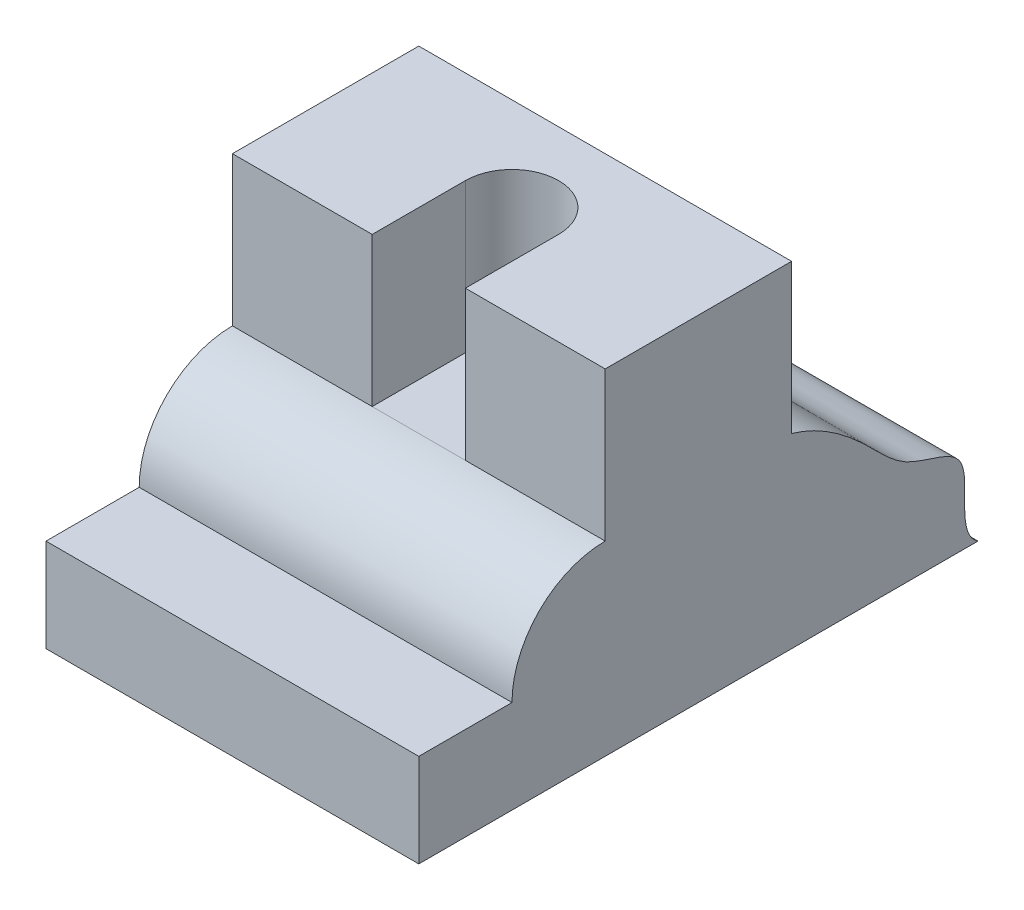
ISO-10303-21;
HEADER;
FILE_DESCRIPTION(('STEP AP214'),'2;1');
FILE_NAME('part.step','',(''),(''),'','','');
FILE_SCHEMA(('AUTOMOTIVE_DESIGN { 1 0 10303 214 1 1 1 1 }'));
ENDSEC;
DATA;
#1=APPLICATION_CONTEXT('core data for automotive mechanical design processes');
#2=APPLICATION_PROTOCOL_DEFINITION('international standard','automotive_design',2000,#1);
#3=PRODUCT_CONTEXT('',#1,'mechanical');
#4=PRODUCT('Part','Part','',(#3));
#5=PRODUCT_RELATED_PRODUCT_CATEGORY('part','',(#4));
#6=PRODUCT_DEFINITION_FORMATION('','',#4);
#7=PRODUCT_DEFINITION_CONTEXT('part definition',#1,'design');
#8=PRODUCT_DEFINITION('design','',#6,#7);
#9=PRODUCT_DEFINITION_SHAPE('','',#8);
#10=(LENGTH_UNIT() NAMED_UNIT(*) SI_UNIT(.MILLI.,.METRE.));
#11=(NAMED_UNIT(*) PLANE_ANGLE_UNIT() SI_UNIT($,.RADIAN.));
#12=(NAMED_UNIT(*) SI_UNIT($,.STERADIAN.) SOLID_ANGLE_UNIT());
#13=UNCERTAINTY_MEASURE_WITH_UNIT(LENGTH_MEASURE(1.E-05),#10,'distance_accuracy_value','');
#14=(GEOMETRIC_REPRESENTATION_CONTEXT(3) GLOBAL_UNCERTAINTY_ASSIGNED_CONTEXT((#13)) GLOBAL_UNIT_ASSIGNED_CONTEXT((#10,
#11,#12)) REPRESENTATION_CONTEXT('',''));
#15=CARTESIAN_POINT('',(0.,0.,0.));
#16=DIRECTION('',(0.,0.,1.));
#17=DIRECTION('',(1.,0.,0.));
#18=AXIS2_PLACEMENT_3D('',#15,#16,#17);
#19=CARTESIAN_POINT('',(0.,100.,0.));
#20=DIRECTION('',(0.,-1.,0.));
#21=DIRECTION('',(0.,0.,-1.));
#22=AXIS2_PLACEMENT_3D('',#19,#20,#21);
#23=PLANE('',#22);
#24=DIRECTION('',(0.,0.,1.));
#25=VECTOR('',#24,1.);
#26=CARTESIAN_POINT('',(25.,100.,0.));
#27=LINE('',#26,#25);
#28=CARTESIAN_POINT('',(25.,100.,0.));
#29=VERTEX_POINT('',#28);
#30=CARTESIAN_POINT('',(25.,100.,50.));
#31=VERTEX_POINT('',#30);
#32=EDGE_CURVE('E56',#29,#31,#27,.T.);
#33=ORIENTED_EDGE('',*,*,#32,.F.);
#34=CARTESIAN_POINT('',(0.,100.,0.));
#35=DIRECTION('',(0.,-1.,0.));
#36=DIRECTION('',(0.,0.,1.));
#37=AXIS2_PLACEMENT_3D('',#34,#35,#36);
#38=CIRCLE('',#37,25.);
#39=CARTESIAN_POINT('',(-25.,100.,0.));
#40=VERTEX_POINT('',#39);
#41=EDGE_CURVE('E265',#40,#29,#38,.T.);
#42=ORIENTED_EDGE('',*,*,#41,.F.);
#43=DIRECTION('',(0.,0.,-1.));
#44=VECTOR('',#43,1.);
#45=CARTESIAN_POINT('',(-25.,100.,0.));
#46=LINE('',#45,#44);
#47=CARTESIAN_POINT('',(-25.,100.,50.));
#48=VERTEX_POINT('',#47);
#49=EDGE_CURVE('E270',#48,#40,#46,.T.);
#50=ORIENTED_EDGE('',*,*,#49,.F.);
#51=DIRECTION('',(1.,0.,0.));
#52=VECTOR('',#51,1.);
#53=CARTESIAN_POINT('',(-100.,100.,50.));
#54=LINE('',#53,#52);
#55=EDGE_CURVE('E48',#48,#31,#54,.T.);
#56=ORIENTED_EDGE('',*,*,#55,.T.);
#57=EDGE_LOOP('',(#33,#42,#50,#56));
#58=FACE_BOUND('',#57,.T.);
#59=ADVANCED_FACE('F39',(#58),#23,.F.);
#60=CARTESIAN_POINT('',(100.,100.,50.));
#61=DIRECTION('',(-1.,0.,0.));
#62=DIRECTION('',(0.,0.,1.));
#63=AXIS2_PLACEMENT_3D('',#60,#61,#62);
#64=PLANE('',#63);
#65=DIRECTION('',(0.,0.,-1.));
#66=VECTOR('',#65,1.);
#67=CARTESIAN_POINT('',(100.,0.,50.));
#68=LINE('',#67,#66);
#69=CARTESIAN_POINT('',(100.,0.,150.));
#70=VERTEX_POINT('',#69);
#71=CARTESIAN_POINT('',(100.,0.,-150.));
#72=VERTEX_POINT('',#71);
#73=EDGE_CURVE('E208',#70,#72,#68,.T.);
#74=ORIENTED_EDGE('',*,*,#73,.T.);
#75=CARTESIAN_POINT('',(100.,100.,-50.));
#76=CARTESIAN_POINT('',(100.,95.1222642668294,-66.7214384147463));
#77=CARTESIAN_POINT('',(100.,78.4454646816312,-87.6218480772081));
#78=CARTESIAN_POINT('',(100.,51.7988343236468,-111.427617310337));
#79=CARTESIAN_POINT('',(100.,47.4008161064059,-153.788531601574));
#80=CARTESIAN_POINT('',(100.,8.56832187900159,-137.140673225042));
#81=CARTESIAN_POINT('',(100.,0.,-150.));
#82=B_SPLINE_CURVE_WITH_KNOTS('',3,(#75,#76,#77,#78,#79,#80,#81),.UNSPECIFIED.,.F.,.F.,(4,1,1,1,
4),(0.,0.338265493761551,0.517817436766426,0.712666980927499,1.),.UNSPECIFIED.);
#83=CARTESIAN_POINT('',(100.,100.,-50.));
#84=VERTEX_POINT('',#83);
#85=EDGE_CURVE('E159',#84,#72,#82,.T.);
#86=ORIENTED_EDGE('',*,*,#85,.F.);
#87=DIRECTION('',(0.,-1.,0.));
#88=VECTOR('',#87,1.);
#89=CARTESIAN_POINT('',(100.,180.,-50.));
#90=LINE('',#89,#88);
#91=CARTESIAN_POINT('',(100.,180.,-50.));
#92=VERTEX_POINT('',#91);
#93=EDGE_CURVE('E243',#92,#84,#90,.T.);
#94=ORIENTED_EDGE('',*,*,#93,.F.);
#95=DIRECTION('',(0.,0.,-1.));
#96=VECTOR('',#95,1.);
#97=CARTESIAN_POINT('',(100.,180.,50.));
#98=LINE('',#97,#96);
#99=CARTESIAN_POINT('',(100.,180.,50.));
#100=VERTEX_POINT('',#99);
#101=EDGE_CURVE('E247',#100,#92,#98,.T.);
#102=ORIENTED_EDGE('',*,*,#101,.F.);
#103=DIRECTION('',(0.,-1.,0.));
#104=VECTOR('',#103,1.);
#105=CARTESIAN_POINT('',(100.,180.,50.));
#106=LINE('',#105,#104);
#107=CARTESIAN_POINT('',(100.,100.,50.));
#108=VERTEX_POINT('',#107);
#109=EDGE_CURVE('E245',#100,#108,#106,.T.);
#110=ORIENTED_EDGE('',*,*,#109,.T.);
#111=CARTESIAN_POINT('',(100.,50.,50.));
#112=DIRECTION('',(-1.,0.,0.));
#113=DIRECTION('',(0.,0.,1.));
#114=AXIS2_PLACEMENT_3D('',#111,#112,#113);
#115=CIRCLE('',#114,50.);
#116=CARTESIAN_POINT('',(100.,50.,100.));
#117=VERTEX_POINT('',#116);
#118=EDGE_CURVE('E228',#117,#108,#115,.T.);
#119=ORIENTED_EDGE('',*,*,#118,.F.);
#120=DIRECTION('',(0.,0.,-1.));
#121=VECTOR('',#120,1.);
#122=CARTESIAN_POINT('',(100.,50.,100.));
#123=LINE('',#122,#121);
#124=CARTESIAN_POINT('',(100.,50.,150.));
#125=VERTEX_POINT('',#124);
#126=EDGE_CURVE('E237',#125,#117,#123,.T.);
#127=ORIENTED_EDGE('',*,*,#126,.F.);
#128=DIRECTION('',(0.,1.,0.));
#129=VECTOR('',#128,1.);
#130=CARTESIAN_POINT('',(100.,50.,150.));
#131=LINE('',#130,#129);
#132=EDGE_CURVE('E214',#70,#125,#131,.T.);
#133=ORIENTED_EDGE('',*,*,#132,.F.);
#134=EDGE_LOOP('',(#74,#86,#94,#102,#110,#119,#127,#133));
#135=FACE_BOUND('',#134,.T.);
#136=ADVANCED_FACE('F41',(#135),#64,.F.);
#137=CARTESIAN_POINT('',(-100.,100.,50.));
#138=DIRECTION('',(1.,0.,0.));
#139=DIRECTION('',(0.,0.,-1.));
#140=AXIS2_PLACEMENT_3D('',#137,#138,#139);
#141=PLANE('',#140);
#142=DIRECTION('',(0.,0.,1.));
#143=VECTOR('',#142,1.);
#144=CARTESIAN_POINT('',(-100.,0.,50.));
#145=LINE('',#144,#143);
#146=CARTESIAN_POINT('',(-100.,0.,-150.));
#147=VERTEX_POINT('',#146);
#148=CARTESIAN_POINT('',(-100.,0.,150.));
#149=VERTEX_POINT('',#148);
#150=EDGE_CURVE('E43',#147,#149,#145,.T.);
#151=ORIENTED_EDGE('',*,*,#150,.T.);
#152=DIRECTION('',(0.,1.,0.));
#153=VECTOR('',#152,1.);
#154=CARTESIAN_POINT('',(-100.,50.,150.));
#155=LINE('',#154,#153);
#156=CARTESIAN_POINT('',(-100.,50.,150.));
#157=VERTEX_POINT('',#156);
#158=EDGE_CURVE('E219',#149,#157,#155,.T.);
#159=ORIENTED_EDGE('',*,*,#158,.T.);
#160=DIRECTION('',(0.,0.,-1.));
#161=VECTOR('',#160,1.);
#162=CARTESIAN_POINT('',(-100.,50.,100.));
#163=LINE('',#162,#161);
#164=CARTESIAN_POINT('',(-100.,50.,100.));
#165=VERTEX_POINT('',#164);
#166=EDGE_CURVE('E232',#157,#165,#163,.T.);
#167=ORIENTED_EDGE('',*,*,#166,.T.);
#168=CARTESIAN_POINT('',(-100.,50.,50.));
#169=DIRECTION('',(-1.,0.,0.));
#170=DIRECTION('',(0.,0.,1.));
#171=AXIS2_PLACEMENT_3D('',#168,#169,#170);
#172=CIRCLE('',#171,50.);
#173=CARTESIAN_POINT('',(-100.,100.,50.));
#174=VERTEX_POINT('',#173);
#175=EDGE_CURVE('E155',#165,#174,#172,.T.);
#176=ORIENTED_EDGE('',*,*,#175,.T.);
#177=DIRECTION('',(0.,-1.,0.));
#178=VECTOR('',#177,1.);
#179=CARTESIAN_POINT('',(-100.,180.,50.));
#180=LINE('',#179,#178);
#181=CARTESIAN_POINT('',(-100.,180.,50.));
#182=VERTEX_POINT('',#181);
#183=EDGE_CURVE('E135',#182,#174,#180,.T.);
#184=ORIENTED_EDGE('',*,*,#183,.F.);
#185=DIRECTION('',(0.,0.,1.));
#186=VECTOR('',#185,1.);
#187=CARTESIAN_POINT('',(-100.,180.,50.));
#188=LINE('',#187,#186);
#189=CARTESIAN_POINT('',(-100.,180.,-50.));
#190=VERTEX_POINT('',#189);
#191=EDGE_CURVE('E141',#190,#182,#188,.T.);
#192=ORIENTED_EDGE('',*,*,#191,.F.);
#193=DIRECTION('',(0.,-1.,0.));
#194=VECTOR('',#193,1.);
#195=CARTESIAN_POINT('',(-100.,180.,-50.));
#196=LINE('',#195,#194);
#197=CARTESIAN_POINT('',(-100.,100.,-50.));
#198=VERTEX_POINT('',#197);
#199=EDGE_CURVE('E242',#190,#198,#196,.T.);
#200=ORIENTED_EDGE('',*,*,#199,.T.);
#201=CARTESIAN_POINT('',(-100.,100.,-50.));
#202=CARTESIAN_POINT('',(-100.,95.1222642668294,-66.7214384147463));
#203=CARTESIAN_POINT('',(-100.,78.4454646816312,-87.6218480772081));
#204=CARTESIAN_POINT('',(-100.,51.7988343236468,-111.427617310337));
#205=CARTESIAN_POINT('',(-100.,47.4008161064059,-153.788531601574));
#206=CARTESIAN_POINT('',(-100.,8.56832187900159,-137.140673225042));
#207=CARTESIAN_POINT('',(-100.,0.,-150.));
#208=B_SPLINE_CURVE_WITH_KNOTS('',3,(#201,#202,#203,#204,#205,#206,#207),.UNSPECIFIED.,.F.,.F.,
(4,1,1,1,4),(0.,0.338265493761551,0.517817436766426,0.712666980927499,1.),.UNSPECIFIED.);
#209=EDGE_CURVE('E156',#198,#147,#208,.T.);
#210=ORIENTED_EDGE('',*,*,#209,.T.);
#211=EDGE_LOOP('',(#151,#159,#167,#176,#184,#192,#200,#210));
#212=FACE_BOUND('',#211,.T.);
#213=ADVANCED_FACE('F152',(#212),#141,.F.);
#214=CARTESIAN_POINT('',(0.,0.,0.));
#215=DIRECTION('',(0.,-1.,0.));
#216=DIRECTION('',(0.,0.,-1.));
#217=AXIS2_PLACEMENT_3D('',#214,#215,#216);
#218=PLANE('',#217);
#219=ORIENTED_EDGE('',*,*,#73,.F.);
#220=DIRECTION('',(-1.,0.,0.));
#221=VECTOR('',#220,1.);
#222=CARTESIAN_POINT('',(100.,0.,150.));
#223=LINE('',#222,#221);
#224=EDGE_CURVE('E225',#70,#149,#223,.T.);
#225=ORIENTED_EDGE('',*,*,#224,.T.);
#226=ORIENTED_EDGE('',*,*,#150,.F.);
#227=DIRECTION('',(-1.,0.,0.));
#228=VECTOR('',#227,1.);
#229=CARTESIAN_POINT('',(100.,0.,-150.));
#230=LINE('',#229,#228);
#231=EDGE_CURVE('E169',#72,#147,#230,.T.);
#232=ORIENTED_EDGE('',*,*,#231,.F.);
#233=EDGE_LOOP('',(#219,#225,#226,#232));
#234=FACE_BOUND('',#233,.T.);
#235=ADVANCED_FACE('F188',(#234),#218,.T.);
#236=CARTESIAN_POINT('',(100.,50.,50.));
#237=DIRECTION('',(-1.,0.,0.));
#238=DIRECTION('',(0.,0.,1.));
#239=AXIS2_PLACEMENT_3D('',#236,#237,#238);
#240=CYLINDRICAL_SURFACE('',#239,50.);
#241=ORIENTED_EDGE('',*,*,#175,.F.);
#242=DIRECTION('',(-1.,0.,0.));
#243=VECTOR('',#242,1.);
#244=CARTESIAN_POINT('',(100.,50.,100.));
#245=LINE('',#244,#243);
#246=EDGE_CURVE('E217',#117,#165,#245,.T.);
#247=ORIENTED_EDGE('',*,*,#246,.F.);
#248=ORIENTED_EDGE('',*,*,#118,.T.);
#249=DIRECTION('',(1.,0.,0.));
#250=VECTOR('',#249,1.);
#251=CARTESIAN_POINT('',(100.,100.,50.));
#252=LINE('',#251,#250);
#253=EDGE_CURVE('E64',#31,#108,#252,.T.);
#254=ORIENTED_EDGE('',*,*,#253,.F.);
#255=ORIENTED_EDGE('',*,*,#55,.F.);
#256=EDGE_CURVE('E11',#174,#48,#54,.T.);
#257=ORIENTED_EDGE('',*,*,#256,.F.);
#258=EDGE_LOOP('',(#241,#247,#248,#254,#255,#257));
#259=FACE_BOUND('',#258,.T.);
#260=ADVANCED_FACE('F184',(#259),#240,.T.);
#261=CARTESIAN_POINT('',(100.,50.,100.));
#262=DIRECTION('',(0.,1.,0.));
#263=DIRECTION('',(0.,0.,1.));
#264=AXIS2_PLACEMENT_3D('',#261,#262,#263);
#265=PLANE('',#264);
#266=ORIENTED_EDGE('',*,*,#166,.F.);
#267=DIRECTION('',(-1.,0.,0.));
#268=VECTOR('',#267,1.);
#269=CARTESIAN_POINT('',(100.,50.,150.));
#270=LINE('',#269,#268);
#271=EDGE_CURVE('E227',#125,#157,#270,.T.);
#272=ORIENTED_EDGE('',*,*,#271,.F.);
#273=ORIENTED_EDGE('',*,*,#126,.T.);
#274=ORIENTED_EDGE('',*,*,#246,.T.);
#275=EDGE_LOOP('',(#266,#272,#273,#274));
#276=FACE_BOUND('',#275,.T.);
#277=ADVANCED_FACE('F187',(#276),#265,.T.);
#278=CARTESIAN_POINT('',(100.,50.,150.));
#279=DIRECTION('',(0.,0.,1.));
#280=DIRECTION('',(1.,0.,0.));
#281=AXIS2_PLACEMENT_3D('',#278,#279,#280);
#282=PLANE('',#281);
#283=ORIENTED_EDGE('',*,*,#158,.F.);
#284=ORIENTED_EDGE('',*,*,#224,.F.);
#285=ORIENTED_EDGE('',*,*,#132,.T.);
#286=ORIENTED_EDGE('',*,*,#271,.T.);
#287=EDGE_LOOP('',(#283,#284,#285,#286));
#288=FACE_BOUND('',#287,.T.);
#289=ADVANCED_FACE('F181',(#288),#282,.T.);
#290=DIRECTION('',(-1.,0.,0.));
#291=VECTOR('',#290,1.);
#292=SURFACE_OF_LINEAR_EXTRUSION('',#82,#291);
#293=ORIENTED_EDGE('',*,*,#209,.F.);
#294=DIRECTION('',(-1.,0.,0.));
#295=VECTOR('',#294,1.);
#296=CARTESIAN_POINT('',(-100.,100.,-50.));
#297=LINE('',#296,#295);
#298=EDGE_CURVE('E221',#84,#198,#297,.T.);
#299=ORIENTED_EDGE('',*,*,#298,.F.);
#300=ORIENTED_EDGE('',*,*,#85,.T.);
#301=ORIENTED_EDGE('',*,*,#231,.T.);
#302=EDGE_LOOP('',(#293,#299,#300,#301));
#303=FACE_BOUND('',#302,.T.);
#304=ADVANCED_FACE('F177',(#303),#292,.T.);
#305=CARTESIAN_POINT('',(-25.,180.,50.));
#306=DIRECTION('',(0.,0.,-1.));
#307=DIRECTION('',(-1.,0.,0.));
#308=AXIS2_PLACEMENT_3D('',#305,#306,#307);
#309=PLANE('',#308);
#310=ORIENTED_EDGE('',*,*,#256,.T.);
#311=DIRECTION('',(0.,-1.,0.));
#312=VECTOR('',#311,1.);
#313=CARTESIAN_POINT('',(-25.,180.,50.));
#314=LINE('',#313,#312);
#315=CARTESIAN_POINT('',(-25.,180.,50.));
#316=VERTEX_POINT('',#315);
#317=EDGE_CURVE('E137',#316,#48,#314,.T.);
#318=ORIENTED_EDGE('',*,*,#317,.F.);
#319=DIRECTION('',(1.,0.,0.));
#320=VECTOR('',#319,1.);
#321=CARTESIAN_POINT('',(-25.,180.,50.));
#322=LINE('',#321,#320);
#323=EDGE_CURVE('E131',#182,#316,#322,.T.);
#324=ORIENTED_EDGE('',*,*,#323,.F.);
#325=ORIENTED_EDGE('',*,*,#183,.T.);
#326=EDGE_LOOP('',(#310,#318,#324,#325));
#327=FACE_BOUND('',#326,.T.);
#328=ADVANCED_FACE('F133',(#327),#309,.F.);
#329=CARTESIAN_POINT('',(-25.,180.,0.));
#330=DIRECTION('',(-1.,0.,0.));
#331=DIRECTION('',(0.,0.,1.));
#332=AXIS2_PLACEMENT_3D('',#329,#330,#331);
#333=PLANE('',#332);
#334=ORIENTED_EDGE('',*,*,#49,.T.);
#335=DIRECTION('',(0.,-1.,0.));
#336=VECTOR('',#335,1.);
#337=CARTESIAN_POINT('',(-25.,180.,0.));
#338=LINE('',#337,#336);
#339=CARTESIAN_POINT('',(-25.,180.,0.));
#340=VERTEX_POINT('',#339);
#341=EDGE_CURVE('E161',#340,#40,#338,.T.);
#342=ORIENTED_EDGE('',*,*,#341,.F.);
#343=DIRECTION('',(0.,0.,-1.));
#344=VECTOR('',#343,1.);
#345=CARTESIAN_POINT('',(-25.,180.,0.));
#346=LINE('',#345,#344);
#347=EDGE_CURVE('E140',#316,#340,#346,.T.);
#348=ORIENTED_EDGE('',*,*,#347,.F.);
#349=ORIENTED_EDGE('',*,*,#317,.T.);
#350=EDGE_LOOP('',(#334,#342,#348,#349));
#351=FACE_BOUND('',#350,.T.);
#352=ADVANCED_FACE('F269',(#351),#333,.F.);
#353=CARTESIAN_POINT('',(0.,180.,0.));
#354=DIRECTION('',(0.,-1.,0.));
#355=DIRECTION('',(0.,0.,-1.));
#356=AXIS2_PLACEMENT_3D('',#353,#354,#355);
#357=CYLINDRICAL_SURFACE('',#356,25.);
#358=ORIENTED_EDGE('',*,*,#41,.T.);
#359=DIRECTION('',(0.,-1.,0.));
#360=VECTOR('',#359,1.);
#361=CARTESIAN_POINT('',(25.,180.,0.));
#362=LINE('',#361,#360);
#363=CARTESIAN_POINT('',(25.,180.,0.));
#364=VERTEX_POINT('',#363);
#365=EDGE_CURVE('E257',#364,#29,#362,.T.);
#366=ORIENTED_EDGE('',*,*,#365,.F.);
#367=CARTESIAN_POINT('',(0.,180.,0.));
#368=DIRECTION('',(0.,-1.,0.));
#369=DIRECTION('',(0.,0.,1.));
#370=AXIS2_PLACEMENT_3D('',#367,#368,#369);
#371=CIRCLE('',#370,25.);
#372=EDGE_CURVE('E266',#340,#364,#371,.T.);
#373=ORIENTED_EDGE('',*,*,#372,.F.);
#374=ORIENTED_EDGE('',*,*,#341,.T.);
#375=EDGE_LOOP('',(#358,#366,#373,#374));
#376=FACE_BOUND('',#375,.T.);
#377=ADVANCED_FACE('F263',(#376),#357,.F.);
#378=CARTESIAN_POINT('',(25.,180.,0.));
#379=DIRECTION('',(1.,0.,0.));
#380=DIRECTION('',(0.,0.,-1.));
#381=AXIS2_PLACEMENT_3D('',#378,#379,#380);
#382=PLANE('',#381);
#383=ORIENTED_EDGE('',*,*,#32,.T.);
#384=DIRECTION('',(0.,-1.,0.));
#385=VECTOR('',#384,1.);
#386=CARTESIAN_POINT('',(25.,180.,50.));
#387=LINE('',#386,#385);
#388=CARTESIAN_POINT('',(25.,180.,50.));
#389=VERTEX_POINT('',#388);
#390=EDGE_CURVE('E254',#389,#31,#387,.T.);
#391=ORIENTED_EDGE('',*,*,#390,.F.);
#392=DIRECTION('',(0.,0.,1.));
#393=VECTOR('',#392,1.);
#394=CARTESIAN_POINT('',(25.,180.,0.));
#395=LINE('',#394,#393);
#396=EDGE_CURVE('E283',#364,#389,#395,.T.);
#397=ORIENTED_EDGE('',*,*,#396,.F.);
#398=ORIENTED_EDGE('',*,*,#365,.T.);
#399=EDGE_LOOP('',(#383,#391,#397,#398));
#400=FACE_BOUND('',#399,.T.);
#401=ADVANCED_FACE('F289',(#400),#382,.F.);
#402=CARTESIAN_POINT('',(100.,180.,50.));
#403=DIRECTION('',(0.,0.,-1.));
#404=DIRECTION('',(-1.,0.,0.));
#405=AXIS2_PLACEMENT_3D('',#402,#403,#404);
#406=PLANE('',#405);
#407=ORIENTED_EDGE('',*,*,#253,.T.);
#408=ORIENTED_EDGE('',*,*,#109,.F.);
#409=DIRECTION('',(1.,0.,0.));
#410=VECTOR('',#409,1.);
#411=CARTESIAN_POINT('',(100.,180.,50.));
#412=LINE('',#411,#410);
#413=EDGE_CURVE('E282',#389,#100,#412,.T.);
#414=ORIENTED_EDGE('',*,*,#413,.F.);
#415=ORIENTED_EDGE('',*,*,#390,.T.);
#416=EDGE_LOOP('',(#407,#408,#414,#415));
#417=FACE_BOUND('',#416,.T.);
#418=ADVANCED_FACE('F278',(#417),#406,.F.);
#419=CARTESIAN_POINT('',(100.,180.,-50.));
#420=DIRECTION('',(0.,0.,1.));
#421=DIRECTION('',(1.,0.,0.));
#422=AXIS2_PLACEMENT_3D('',#419,#420,#421);
#423=PLANE('',#422);
#424=ORIENTED_EDGE('',*,*,#298,.T.);
#425=ORIENTED_EDGE('',*,*,#199,.F.);
#426=DIRECTION('',(-1.,0.,0.));
#427=VECTOR('',#426,1.);
#428=CARTESIAN_POINT('',(100.,180.,-50.));
#429=LINE('',#428,#427);
#430=EDGE_CURVE('E146',#92,#190,#429,.T.);
#431=ORIENTED_EDGE('',*,*,#430,.F.);
#432=ORIENTED_EDGE('',*,*,#93,.T.);
#433=EDGE_LOOP('',(#424,#425,#431,#432));
#434=FACE_BOUND('',#433,.T.);
#435=ADVANCED_FACE('F296',(#434),#423,.F.);
#436=CARTESIAN_POINT('',(0.,180.,0.));
#437=DIRECTION('',(0.,1.,0.));
#438=DIRECTION('',(0.,0.,1.));
#439=AXIS2_PLACEMENT_3D('',#436,#437,#438);
#440=PLANE('',#439);
#441=ORIENTED_EDGE('',*,*,#191,.T.);
#442=ORIENTED_EDGE('',*,*,#323,.T.);
#443=ORIENTED_EDGE('',*,*,#347,.T.);
#444=ORIENTED_EDGE('',*,*,#372,.T.);
#445=ORIENTED_EDGE('',*,*,#396,.T.);
#446=ORIENTED_EDGE('',*,*,#413,.T.);
#447=ORIENTED_EDGE('',*,*,#101,.T.);
#448=ORIENTED_EDGE('',*,*,#430,.T.);
#449=EDGE_LOOP('',(#441,#442,#443,#444,#445,#446,#447,#448));
#450=FACE_BOUND('',#449,.T.);
#451=ADVANCED_FACE('F144',(#450),#440,.T.);
#452=CLOSED_SHELL('',(#59,#136,#213,#235,#260,#277,#289,#304,#328,#352,#377,#401,#418,#435,#451));
#453=MANIFOLD_SOLID_BREP('B2',#452);
#454=ADVANCED_BREP_SHAPE_REPRESENTATION('',(#18,#453),#14);
#455=SHAPE_DEFINITION_REPRESENTATION(#9,#454);
ENDSEC;
END-ISO-10303-21;
